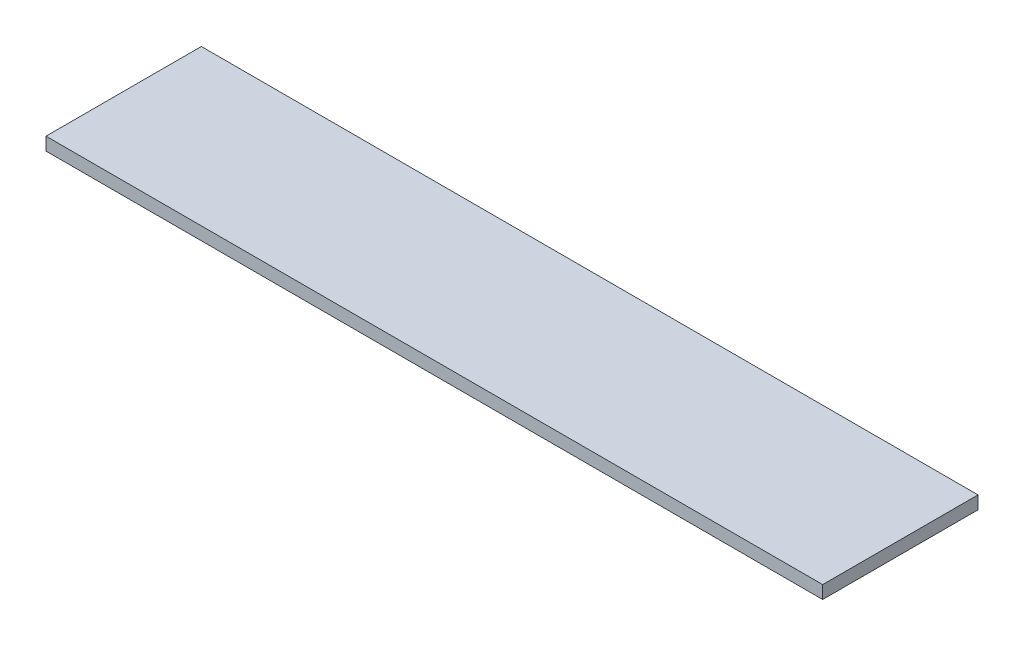
ISO-10303-21;
HEADER;
FILE_DESCRIPTION(('STEP AP214'),'2;1');
FILE_NAME('part.step','',(''),(''),'','','');
FILE_SCHEMA(('AUTOMOTIVE_DESIGN { 1 0 10303 214 1 1 1 1 }'));
ENDSEC;
DATA;
#1=APPLICATION_CONTEXT('core data for automotive mechanical design processes');
#2=APPLICATION_PROTOCOL_DEFINITION('international standard','automotive_design',2000,#1);
#3=PRODUCT_CONTEXT('',#1,'mechanical');
#4=PRODUCT('Part','Part','',(#3));
#5=PRODUCT_RELATED_PRODUCT_CATEGORY('part','',(#4));
#6=PRODUCT_DEFINITION_FORMATION('','',#4);
#7=PRODUCT_DEFINITION_CONTEXT('part definition',#1,'design');
#8=PRODUCT_DEFINITION('design','',#6,#7);
#9=PRODUCT_DEFINITION_SHAPE('','',#8);
#10=(LENGTH_UNIT() NAMED_UNIT(*) SI_UNIT(.MILLI.,.METRE.));
#11=(NAMED_UNIT(*) PLANE_ANGLE_UNIT() SI_UNIT($,.RADIAN.));
#12=(NAMED_UNIT(*) SI_UNIT($,.STERADIAN.) SOLID_ANGLE_UNIT());
#13=UNCERTAINTY_MEASURE_WITH_UNIT(LENGTH_MEASURE(1.E-05),#10,'distance_accuracy_value','');
#14=(GEOMETRIC_REPRESENTATION_CONTEXT(3) GLOBAL_UNCERTAINTY_ASSIGNED_CONTEXT((#13)) GLOBAL_UNIT_ASSIGNED_CONTEXT((#10,
#11,#12)) REPRESENTATION_CONTEXT('',''));
#15=CARTESIAN_POINT('',(0.,0.,0.));
#16=DIRECTION('',(0.,0.,1.));
#17=DIRECTION('',(1.,0.,0.));
#18=AXIS2_PLACEMENT_3D('',#15,#16,#17);
#19=CARTESIAN_POINT('',(190.5,6.35,38.1));
#20=DIRECTION('',(-1.,0.,0.));
#21=DIRECTION('',(0.,0.,1.));
#22=AXIS2_PLACEMENT_3D('',#19,#20,#21);
#23=PLANE('',#22);
#24=DIRECTION('',(0.,0.,-1.));
#25=VECTOR('',#24,1.);
#26=CARTESIAN_POINT('',(190.5,0.,38.1));
#27=LINE('',#26,#25);
#28=CARTESIAN_POINT('',(190.5,0.,38.1));
#29=VERTEX_POINT('',#28);
#30=CARTESIAN_POINT('',(190.5,0.,-38.1));
#31=VERTEX_POINT('',#30);
#32=EDGE_CURVE('E96',#29,#31,#27,.T.);
#33=ORIENTED_EDGE('',*,*,#32,.T.);
#34=DIRECTION('',(0.,-1.,0.));
#35=VECTOR('',#34,1.);
#36=CARTESIAN_POINT('',(190.5,6.35,-38.1));
#37=LINE('',#36,#35);
#38=CARTESIAN_POINT('',(190.5,6.35,-38.1));
#39=VERTEX_POINT('',#38);
#40=EDGE_CURVE('E11',#39,#31,#37,.T.);
#41=ORIENTED_EDGE('',*,*,#40,.F.);
#42=DIRECTION('',(0.,0.,-1.));
#43=VECTOR('',#42,1.);
#44=CARTESIAN_POINT('',(190.5,6.35,38.1));
#45=LINE('',#44,#43);
#46=CARTESIAN_POINT('',(190.5,6.35,38.1));
#47=VERTEX_POINT('',#46);
#48=EDGE_CURVE('E84',#47,#39,#45,.T.);
#49=ORIENTED_EDGE('',*,*,#48,.F.);
#50=DIRECTION('',(0.,-1.,0.));
#51=VECTOR('',#50,1.);
#52=CARTESIAN_POINT('',(190.5,6.35,38.1));
#53=LINE('',#52,#51);
#54=EDGE_CURVE('E92',#47,#29,#53,.T.);
#55=ORIENTED_EDGE('',*,*,#54,.T.);
#56=EDGE_LOOP('',(#33,#41,#49,#55));
#57=FACE_BOUND('',#56,.T.);
#58=ADVANCED_FACE('F33',(#57),#23,.F.);
#59=CARTESIAN_POINT('',(-190.5,6.35,-38.1));
#60=DIRECTION('',(0.,0.,1.));
#61=DIRECTION('',(1.,0.,0.));
#62=AXIS2_PLACEMENT_3D('',#59,#60,#61);
#63=PLANE('',#62);
#64=DIRECTION('',(-1.,0.,0.));
#65=VECTOR('',#64,1.);
#66=CARTESIAN_POINT('',(-190.5,0.,-38.1));
#67=LINE('',#66,#65);
#68=CARTESIAN_POINT('',(-190.5,0.,-38.1));
#69=VERTEX_POINT('',#68);
#70=EDGE_CURVE('E88',#31,#69,#67,.T.);
#71=ORIENTED_EDGE('',*,*,#70,.T.);
#72=DIRECTION('',(0.,-1.,0.));
#73=VECTOR('',#72,1.);
#74=CARTESIAN_POINT('',(-190.5,6.35,-38.1));
#75=LINE('',#74,#73);
#76=CARTESIAN_POINT('',(-190.5,6.35,-38.1));
#77=VERTEX_POINT('',#76);
#78=EDGE_CURVE('E41',#77,#69,#75,.T.);
#79=ORIENTED_EDGE('',*,*,#78,.F.);
#80=DIRECTION('',(-1.,0.,0.));
#81=VECTOR('',#80,1.);
#82=CARTESIAN_POINT('',(-190.5,6.35,-38.1));
#83=LINE('',#82,#81);
#84=EDGE_CURVE('E79',#39,#77,#83,.T.);
#85=ORIENTED_EDGE('',*,*,#84,.F.);
#86=ORIENTED_EDGE('',*,*,#40,.T.);
#87=EDGE_LOOP('',(#71,#79,#85,#86));
#88=FACE_BOUND('',#87,.T.);
#89=ADVANCED_FACE('F87',(#88),#63,.F.);
#90=CARTESIAN_POINT('',(-190.5,6.35,38.1));
#91=DIRECTION('',(1.,0.,0.));
#92=DIRECTION('',(0.,0.,-1.));
#93=AXIS2_PLACEMENT_3D('',#90,#91,#92);
#94=PLANE('',#93);
#95=DIRECTION('',(0.,0.,1.));
#96=VECTOR('',#95,1.);
#97=CARTESIAN_POINT('',(-190.5,0.,38.1));
#98=LINE('',#97,#96);
#99=CARTESIAN_POINT('',(-190.5,0.,38.1));
#100=VERTEX_POINT('',#99);
#101=EDGE_CURVE('E66',#69,#100,#98,.T.);
#102=ORIENTED_EDGE('',*,*,#101,.T.);
#103=DIRECTION('',(0.,-1.,0.));
#104=VECTOR('',#103,1.);
#105=CARTESIAN_POINT('',(-190.5,6.35,38.1));
#106=LINE('',#105,#104);
#107=CARTESIAN_POINT('',(-190.5,6.35,38.1));
#108=VERTEX_POINT('',#107);
#109=EDGE_CURVE('E89',#108,#100,#106,.T.);
#110=ORIENTED_EDGE('',*,*,#109,.F.);
#111=DIRECTION('',(0.,0.,1.));
#112=VECTOR('',#111,1.);
#113=CARTESIAN_POINT('',(-190.5,6.35,38.1));
#114=LINE('',#113,#112);
#115=EDGE_CURVE('E82',#77,#108,#114,.T.);
#116=ORIENTED_EDGE('',*,*,#115,.F.);
#117=ORIENTED_EDGE('',*,*,#78,.T.);
#118=EDGE_LOOP('',(#102,#110,#116,#117));
#119=FACE_BOUND('',#118,.T.);
#120=ADVANCED_FACE('F90',(#119),#94,.F.);
#121=CARTESIAN_POINT('',(-190.5,6.35,38.1));
#122=DIRECTION('',(0.,0.,-1.));
#123=DIRECTION('',(-1.,0.,0.));
#124=AXIS2_PLACEMENT_3D('',#121,#122,#123);
#125=PLANE('',#124);
#126=DIRECTION('',(1.,0.,0.));
#127=VECTOR('',#126,1.);
#128=CARTESIAN_POINT('',(-190.5,0.,38.1));
#129=LINE('',#128,#127);
#130=EDGE_CURVE('E72',#100,#29,#129,.T.);
#131=ORIENTED_EDGE('',*,*,#130,.T.);
#132=ORIENTED_EDGE('',*,*,#54,.F.);
#133=DIRECTION('',(1.,0.,0.));
#134=VECTOR('',#133,1.);
#135=CARTESIAN_POINT('',(-190.5,6.35,38.1));
#136=LINE('',#135,#134);
#137=EDGE_CURVE('E49',#108,#47,#136,.T.);
#138=ORIENTED_EDGE('',*,*,#137,.F.);
#139=ORIENTED_EDGE('',*,*,#109,.T.);
#140=EDGE_LOOP('',(#131,#132,#138,#139));
#141=FACE_BOUND('',#140,.T.);
#142=ADVANCED_FACE('F103',(#141),#125,.F.);
#143=CARTESIAN_POINT('',(0.,6.35,0.));
#144=DIRECTION('',(0.,-1.,0.));
#145=DIRECTION('',(0.,0.,-1.));
#146=AXIS2_PLACEMENT_3D('',#143,#144,#145);
#147=PLANE('',#146);
#148=ORIENTED_EDGE('',*,*,#48,.T.);
#149=ORIENTED_EDGE('',*,*,#84,.T.);
#150=ORIENTED_EDGE('',*,*,#115,.T.);
#151=ORIENTED_EDGE('',*,*,#137,.T.);
#152=EDGE_LOOP('',(#148,#149,#150,#151));
#153=FACE_BOUND('',#152,.T.);
#154=ADVANCED_FACE('F80',(#153),#147,.F.);
#155=CARTESIAN_POINT('',(0.,0.,0.));
#156=DIRECTION('',(0.,-1.,0.));
#157=DIRECTION('',(0.,0.,-1.));
#158=AXIS2_PLACEMENT_3D('',#155,#156,#157);
#159=PLANE('',#158);
#160=ORIENTED_EDGE('',*,*,#32,.F.);
#161=ORIENTED_EDGE('',*,*,#130,.F.);
#162=ORIENTED_EDGE('',*,*,#101,.F.);
#163=ORIENTED_EDGE('',*,*,#70,.F.);
#164=EDGE_LOOP('',(#160,#161,#162,#163));
#165=FACE_BOUND('',#164,.T.);
#166=ADVANCED_FACE('F106',(#165),#159,.T.);
#167=CLOSED_SHELL('',(#58,#89,#120,#142,#154,#166));
#168=MANIFOLD_SOLID_BREP('B2',#167);
#169=ADVANCED_BREP_SHAPE_REPRESENTATION('',(#18,#168),#14);
#170=SHAPE_DEFINITION_REPRESENTATION(#9,#169);
ENDSEC;
END-ISO-10303-21;
